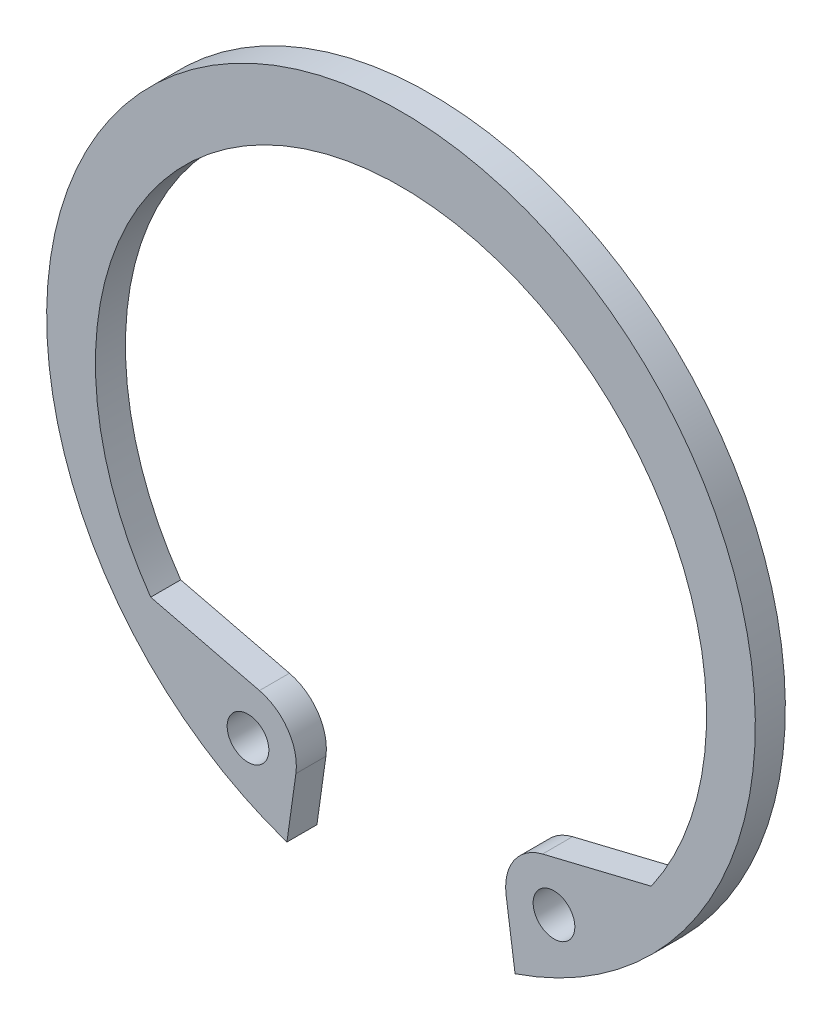
ISO-10303-21;
HEADER;
FILE_DESCRIPTION(('STEP AP214'),'2;1');
FILE_NAME('part.step','',(''),(''),'','','');
FILE_SCHEMA(('AUTOMOTIVE_DESIGN { 1 0 10303 214 1 1 1 1 }'));
ENDSEC;
DATA;
#1=APPLICATION_CONTEXT('core data for automotive mechanical design processes');
#2=APPLICATION_PROTOCOL_DEFINITION('international standard','automotive_design',2000,#1);
#3=PRODUCT_CONTEXT('',#1,'mechanical');
#4=PRODUCT('Part','Part','',(#3));
#5=PRODUCT_RELATED_PRODUCT_CATEGORY('part','',(#4));
#6=PRODUCT_DEFINITION_FORMATION('','',#4);
#7=PRODUCT_DEFINITION_CONTEXT('part definition',#1,'design');
#8=PRODUCT_DEFINITION('design','',#6,#7);
#9=PRODUCT_DEFINITION_SHAPE('','',#8);
#10=(LENGTH_UNIT() NAMED_UNIT(*) SI_UNIT(.MILLI.,.METRE.));
#11=(NAMED_UNIT(*) PLANE_ANGLE_UNIT() SI_UNIT($,.RADIAN.));
#12=(NAMED_UNIT(*) SI_UNIT($,.STERADIAN.) SOLID_ANGLE_UNIT());
#13=UNCERTAINTY_MEASURE_WITH_UNIT(LENGTH_MEASURE(1.E-05),#10,'distance_accuracy_value','');
#14=(GEOMETRIC_REPRESENTATION_CONTEXT(3) GLOBAL_UNCERTAINTY_ASSIGNED_CONTEXT((#13)) GLOBAL_UNIT_ASSIGNED_CONTEXT((#10,
#11,#12)) REPRESENTATION_CONTEXT('',''));
#15=CARTESIAN_POINT('',(0.,0.,0.));
#16=DIRECTION('',(0.,0.,1.));
#17=DIRECTION('',(1.,0.,0.));
#18=AXIS2_PLACEMENT_3D('',#15,#16,#17);
#19=CARTESIAN_POINT('',(-8.48890326991949,-13.0738949087531,1.8));
#20=DIRECTION('',(-0.236585079338112,-0.971610776100481,0.));
#21=DIRECTION('',(0.971610776100481,-0.236585079338112,0.));
#22=AXIS2_PLACEMENT_3D('',#19,#20,#21);
#23=PLANE('',#22);
#24=DIRECTION('',(-0.971610776100481,0.236585079338112,0.));
#25=VECTOR('',#24,1.);
#26=CARTESIAN_POINT('',(-8.48890326991949,-13.0738949087531,0.));
#27=LINE('',#26,#25);
#28=CARTESIAN_POINT('',(-8.48890326991949,-13.0738949087531,0.));
#29=VERTEX_POINT('',#28);
#30=CARTESIAN_POINT('',(-15.0109612115958,-11.4857881961329,0.));
#31=VERTEX_POINT('',#30);
#32=EDGE_CURVE('E98',#29,#31,#27,.T.);
#33=ORIENTED_EDGE('',*,*,#32,.T.);
#34=DIRECTION('',(0.,0.,-1.));
#35=VECTOR('',#34,1.);
#36=CARTESIAN_POINT('',(-15.0109612115958,-11.4857881961329,1.8));
#37=LINE('',#36,#35);
#38=CARTESIAN_POINT('',(-15.0109612115958,-11.4857881961329,1.8));
#39=VERTEX_POINT('',#38);
#40=EDGE_CURVE('E11',#39,#31,#37,.T.);
#41=ORIENTED_EDGE('',*,*,#40,.F.);
#42=DIRECTION('',(-0.971610776100481,0.236585079338112,0.));
#43=VECTOR('',#42,1.);
#44=CARTESIAN_POINT('',(-8.48890326991949,-13.0738949087531,1.8));
#45=LINE('',#44,#43);
#46=CARTESIAN_POINT('',(-8.48890326991949,-13.0738949087531,1.8));
#47=VERTEX_POINT('',#46);
#48=EDGE_CURVE('E118',#47,#39,#45,.T.);
#49=ORIENTED_EDGE('',*,*,#48,.F.);
#50=DIRECTION('',(0.,0.,-1.));
#51=VECTOR('',#50,1.);
#52=CARTESIAN_POINT('',(-8.48890326991949,-13.0738949087531,1.8));
#53=LINE('',#52,#51);
#54=EDGE_CURVE('E133',#47,#29,#53,.T.);
#55=ORIENTED_EDGE('',*,*,#54,.T.);
#56=EDGE_LOOP('',(#33,#41,#49,#55));
#57=FACE_BOUND('',#56,.T.);
#58=ADVANCED_FACE('F17',(#57),#23,.F.);
#59=CARTESIAN_POINT('',(0.,-0.975,1.8));
#60=DIRECTION('',(0.,0.,-1.));
#61=DIRECTION('',(-1.,0.,0.));
#62=AXIS2_PLACEMENT_3D('',#59,#60,#61);
#63=CYLINDRICAL_SURFACE('',#62,18.325);
#64=CARTESIAN_POINT('',(0.,-0.975,0.));
#65=DIRECTION('',(0.,0.,1.));
#66=DIRECTION('',(1.,0.,0.));
#67=AXIS2_PLACEMENT_3D('',#64,#65,#66);
#68=CIRCLE('',#67,18.325);
#69=CARTESIAN_POINT('',(15.0109612115957,-11.4857881961329,0.));
#70=VERTEX_POINT('',#69);
#71=EDGE_CURVE('E92',#70,#31,#68,.T.);
#72=ORIENTED_EDGE('',*,*,#71,.F.);
#73=DIRECTION('',(0.,0.,-1.));
#74=VECTOR('',#73,1.);
#75=CARTESIAN_POINT('',(15.0109612115957,-11.4857881961329,1.8));
#76=LINE('',#75,#74);
#77=CARTESIAN_POINT('',(15.0109612115957,-11.4857881961329,1.8));
#78=VERTEX_POINT('',#77);
#79=EDGE_CURVE('E20',#78,#70,#76,.T.);
#80=ORIENTED_EDGE('',*,*,#79,.F.);
#81=CARTESIAN_POINT('',(0.,-0.975,1.8));
#82=DIRECTION('',(0.,0.,1.));
#83=DIRECTION('',(1.,0.,0.));
#84=AXIS2_PLACEMENT_3D('',#81,#82,#83);
#85=CIRCLE('',#84,18.325);
#86=EDGE_CURVE('E121',#78,#39,#85,.T.);
#87=ORIENTED_EDGE('',*,*,#86,.T.);
#88=ORIENTED_EDGE('',*,*,#40,.T.);
#89=EDGE_LOOP('',(#72,#80,#87,#88));
#90=FACE_BOUND('',#89,.T.);
#91=ADVANCED_FACE('F93',(#90),#63,.F.);
#92=CARTESIAN_POINT('',(8.48890326991948,-13.073894908753,1.8));
#93=DIRECTION('',(-0.236585079338107,0.971610776100482,0.));
#94=DIRECTION('',(-0.971610776100482,-0.236585079338107,0.));
#95=AXIS2_PLACEMENT_3D('',#92,#93,#94);
#96=PLANE('',#95);
#97=DIRECTION('',(0.971610776100482,0.236585079338107,0.));
#98=VECTOR('',#97,1.);
#99=CARTESIAN_POINT('',(8.48890326991948,-13.073894908753,0.));
#100=LINE('',#99,#98);
#101=CARTESIAN_POINT('',(8.48890326991948,-13.073894908753,0.));
#102=VERTEX_POINT('',#101);
#103=EDGE_CURVE('E84',#102,#70,#100,.T.);
#104=ORIENTED_EDGE('',*,*,#103,.F.);
#105=DIRECTION('',(0.,0.,-1.));
#106=VECTOR('',#105,1.);
#107=CARTESIAN_POINT('',(8.48890326991948,-13.073894908753,1.8));
#108=LINE('',#107,#106);
#109=CARTESIAN_POINT('',(8.48890326991948,-13.073894908753,1.8));
#110=VERTEX_POINT('',#109);
#111=EDGE_CURVE('E90',#110,#102,#108,.T.);
#112=ORIENTED_EDGE('',*,*,#111,.F.);
#113=DIRECTION('',(0.971610776100482,0.236585079338107,0.));
#114=VECTOR('',#113,1.);
#115=CARTESIAN_POINT('',(8.48890326991948,-13.073894908753,1.8));
#116=LINE('',#115,#114);
#117=EDGE_CURVE('E86',#110,#78,#116,.T.);
#118=ORIENTED_EDGE('',*,*,#117,.T.);
#119=ORIENTED_EDGE('',*,*,#79,.T.);
#120=EDGE_LOOP('',(#104,#112,#118,#119));
#121=FACE_BOUND('',#120,.T.);
#122=ADVANCED_FACE('F82',(#121),#96,.T.);
#123=CARTESIAN_POINT('',(9.175,-15.8915661594444,1.8));
#124=DIRECTION('',(0.,0.,-1.));
#125=DIRECTION('',(-1.,0.,0.));
#126=AXIS2_PLACEMENT_3D('',#123,#124,#125);
#127=CYLINDRICAL_SURFACE('',#126,2.9);
#128=CARTESIAN_POINT('',(9.175,-15.8915661594444,0.));
#129=DIRECTION('',(0.,0.,1.));
#130=DIRECTION('',(1.,0.,0.));
#131=AXIS2_PLACEMENT_3D('',#128,#129,#130);
#132=CIRCLE('',#131,2.9);
#133=CARTESIAN_POINT('',(6.30322260064945,-16.2951681522287,0.));
#134=VERTEX_POINT('',#133);
#135=EDGE_CURVE('E103',#102,#134,#132,.T.);
#136=ORIENTED_EDGE('',*,*,#135,.T.);
#137=DIRECTION('',(0.,0.,-1.));
#138=VECTOR('',#137,1.);
#139=CARTESIAN_POINT('',(6.30322260064945,-16.2951681522287,1.8));
#140=LINE('',#139,#138);
#141=CARTESIAN_POINT('',(6.30322260064945,-16.2951681522287,1.8));
#142=VERTEX_POINT('',#141);
#143=EDGE_CURVE('E143',#142,#134,#140,.T.);
#144=ORIENTED_EDGE('',*,*,#143,.F.);
#145=CARTESIAN_POINT('',(9.175,-15.8915661594444,1.8));
#146=DIRECTION('',(0.,0.,1.));
#147=DIRECTION('',(1.,0.,0.));
#148=AXIS2_PLACEMENT_3D('',#145,#146,#147);
#149=CIRCLE('',#148,2.9);
#150=EDGE_CURVE('E124',#110,#142,#149,.T.);
#151=ORIENTED_EDGE('',*,*,#150,.F.);
#152=ORIENTED_EDGE('',*,*,#111,.T.);
#153=EDGE_LOOP('',(#136,#144,#151,#152));
#154=FACE_BOUND('',#153,.T.);
#155=ADVANCED_FACE('F148',(#154),#127,.T.);
#156=CARTESIAN_POINT('',(6.30322260064945,-16.2951681522287,1.8));
#157=DIRECTION('',(0.990268068741571,0.139173100960064,0.));
#158=DIRECTION('',(-0.139173100960064,0.990268068741571,0.));
#159=AXIS2_PLACEMENT_3D('',#156,#157,#158);
#160=PLANE('',#159);
#161=DIRECTION('',(0.139173100960064,-0.99026806874157,0.));
#162=VECTOR('',#161,1.);
#163=CARTESIAN_POINT('',(6.30322260064945,-16.2951681522287,0.));
#164=LINE('',#163,#162);
#165=CARTESIAN_POINT('',(6.84060765155379,-20.1188614726953,0.));
#166=VERTEX_POINT('',#165);
#167=EDGE_CURVE('E105',#134,#166,#164,.T.);
#168=ORIENTED_EDGE('',*,*,#167,.T.);
#169=DIRECTION('',(0.,0.,-1.));
#170=VECTOR('',#169,1.);
#171=CARTESIAN_POINT('',(6.84060765155379,-20.1188614726953,1.8));
#172=LINE('',#171,#170);
#173=CARTESIAN_POINT('',(6.84060765155379,-20.1188614726953,1.8));
#174=VERTEX_POINT('',#173);
#175=EDGE_CURVE('E140',#174,#166,#172,.T.);
#176=ORIENTED_EDGE('',*,*,#175,.F.);
#177=DIRECTION('',(0.139173100960064,-0.99026806874157,0.));
#178=VECTOR('',#177,1.);
#179=CARTESIAN_POINT('',(6.30322260064945,-16.2951681522287,1.8));
#180=LINE('',#179,#178);
#181=EDGE_CURVE('E126',#142,#174,#180,.T.);
#182=ORIENTED_EDGE('',*,*,#181,.F.);
#183=ORIENTED_EDGE('',*,*,#143,.T.);
#184=EDGE_LOOP('',(#168,#176,#182,#183));
#185=FACE_BOUND('',#184,.T.);
#186=ADVANCED_FACE('F164',(#185),#160,.F.);
#187=CARTESIAN_POINT('',(0.,0.,1.8));
#188=DIRECTION('',(0.,0.,-1.));
#189=DIRECTION('',(-1.,0.,0.));
#190=AXIS2_PLACEMENT_3D('',#187,#188,#189);
#191=CYLINDRICAL_SURFACE('',#190,21.25);
#192=CARTESIAN_POINT('',(0.,0.,0.));
#193=DIRECTION('',(0.,0.,1.));
#194=DIRECTION('',(1.,0.,0.));
#195=AXIS2_PLACEMENT_3D('',#192,#193,#194);
#196=CIRCLE('',#195,21.25);
#197=CARTESIAN_POINT('',(-6.8406076515538,-20.1188614726953,0.));
#198=VERTEX_POINT('',#197);
#199=EDGE_CURVE('E110',#166,#198,#196,.T.);
#200=ORIENTED_EDGE('',*,*,#199,.T.);
#201=DIRECTION('',(0.,0.,-1.));
#202=VECTOR('',#201,1.);
#203=CARTESIAN_POINT('',(-6.8406076515538,-20.1188614726953,1.8));
#204=LINE('',#203,#202);
#205=CARTESIAN_POINT('',(-6.8406076515538,-20.1188614726953,1.8));
#206=VERTEX_POINT('',#205);
#207=EDGE_CURVE('E138',#206,#198,#204,.T.);
#208=ORIENTED_EDGE('',*,*,#207,.F.);
#209=CARTESIAN_POINT('',(0.,0.,1.8));
#210=DIRECTION('',(0.,0.,1.));
#211=DIRECTION('',(1.,0.,0.));
#212=AXIS2_PLACEMENT_3D('',#209,#210,#211);
#213=CIRCLE('',#212,21.25);
#214=EDGE_CURVE('E128',#174,#206,#213,.T.);
#215=ORIENTED_EDGE('',*,*,#214,.F.);
#216=ORIENTED_EDGE('',*,*,#175,.T.);
#217=EDGE_LOOP('',(#200,#208,#215,#216));
#218=FACE_BOUND('',#217,.T.);
#219=ADVANCED_FACE('F161',(#218),#191,.T.);
#220=CARTESIAN_POINT('',(-6.30322260064944,-16.2951681522287,1.8));
#221=DIRECTION('',(0.99026806874157,-0.139173100960068,0.));
#222=DIRECTION('',(0.139173100960068,0.99026806874157,0.));
#223=AXIS2_PLACEMENT_3D('',#220,#221,#222);
#224=PLANE('',#223);
#225=DIRECTION('',(-0.139173100960068,-0.99026806874157,0.));
#226=VECTOR('',#225,1.);
#227=CARTESIAN_POINT('',(-6.30322260064944,-16.2951681522287,0.));
#228=LINE('',#227,#226);
#229=CARTESIAN_POINT('',(-6.30322260064944,-16.2951681522287,0.));
#230=VERTEX_POINT('',#229);
#231=EDGE_CURVE('E113',#230,#198,#228,.T.);
#232=ORIENTED_EDGE('',*,*,#231,.F.);
#233=DIRECTION('',(0.,0.,-1.));
#234=VECTOR('',#233,1.);
#235=CARTESIAN_POINT('',(-6.30322260064944,-16.2951681522287,1.8));
#236=LINE('',#235,#234);
#237=CARTESIAN_POINT('',(-6.30322260064944,-16.2951681522287,1.8));
#238=VERTEX_POINT('',#237);
#239=EDGE_CURVE('E39',#238,#230,#236,.T.);
#240=ORIENTED_EDGE('',*,*,#239,.F.);
#241=DIRECTION('',(-0.139173100960068,-0.99026806874157,0.));
#242=VECTOR('',#241,1.);
#243=CARTESIAN_POINT('',(-6.30322260064944,-16.2951681522287,1.8));
#244=LINE('',#243,#242);
#245=EDGE_CURVE('E130',#238,#206,#244,.T.);
#246=ORIENTED_EDGE('',*,*,#245,.T.);
#247=ORIENTED_EDGE('',*,*,#207,.T.);
#248=EDGE_LOOP('',(#232,#240,#246,#247));
#249=FACE_BOUND('',#248,.T.);
#250=ADVANCED_FACE('F157',(#249),#224,.T.);
#251=CARTESIAN_POINT('',(-9.175,-15.8915661594444,1.8));
#252=DIRECTION('',(0.,0.,-1.));
#253=DIRECTION('',(-1.,0.,0.));
#254=AXIS2_PLACEMENT_3D('',#251,#252,#253);
#255=CYLINDRICAL_SURFACE('',#254,2.9);
#256=CARTESIAN_POINT('',(-9.175,-15.8915661594444,0.));
#257=DIRECTION('',(0.,0.,1.));
#258=DIRECTION('',(1.,0.,0.));
#259=AXIS2_PLACEMENT_3D('',#256,#257,#258);
#260=CIRCLE('',#259,2.9);
#261=EDGE_CURVE('E116',#230,#29,#260,.T.);
#262=ORIENTED_EDGE('',*,*,#261,.T.);
#263=ORIENTED_EDGE('',*,*,#54,.F.);
#264=CARTESIAN_POINT('',(-9.175,-15.8915661594444,1.8));
#265=DIRECTION('',(0.,0.,1.));
#266=DIRECTION('',(1.,0.,0.));
#267=AXIS2_PLACEMENT_3D('',#264,#265,#266);
#268=CIRCLE('',#267,2.9);
#269=EDGE_CURVE('E31',#238,#47,#268,.T.);
#270=ORIENTED_EDGE('',*,*,#269,.F.);
#271=ORIENTED_EDGE('',*,*,#239,.T.);
#272=EDGE_LOOP('',(#262,#263,#270,#271));
#273=FACE_BOUND('',#272,.T.);
#274=ADVANCED_FACE('F212',(#273),#255,.T.);
#275=CARTESIAN_POINT('',(0.,-0.975,1.8));
#276=DIRECTION('',(0.,0.,1.));
#277=DIRECTION('',(1.,0.,0.));
#278=AXIS2_PLACEMENT_3D('',#275,#276,#277);
#279=PLANE('',#278);
#280=CARTESIAN_POINT('',(9.175,-15.8915661594444,1.8));
#281=DIRECTION('',(0.,0.,-1.));
#282=DIRECTION('',(0.,1.,0.));
#283=AXIS2_PLACEMENT_3D('',#280,#281,#282);
#284=CIRCLE('',#283,1.25);
#285=CARTESIAN_POINT('',(9.175,-14.6415661594445,1.8));
#286=VERTEX_POINT('',#285);
#287=EDGE_CURVE('E267',#286,#286,#284,.T.);
#288=ORIENTED_EDGE('',*,*,#287,.T.);
#289=EDGE_LOOP('',(#288));
#290=FACE_BOUND('',#289,.T.);
#291=CARTESIAN_POINT('',(-9.175,-15.8915661594444,1.8));
#292=DIRECTION('',(0.,0.,-1.));
#293=DIRECTION('',(0.,1.,0.));
#294=AXIS2_PLACEMENT_3D('',#291,#292,#293);
#295=CIRCLE('',#294,1.25);
#296=CARTESIAN_POINT('',(-9.175,-14.6415661594445,1.8));
#297=VERTEX_POINT('',#296);
#298=EDGE_CURVE('E120',#297,#297,#295,.T.);
#299=ORIENTED_EDGE('',*,*,#298,.T.);
#300=EDGE_LOOP('',(#299));
#301=FACE_BOUND('',#300,.T.);
#302=ORIENTED_EDGE('',*,*,#48,.T.);
#303=ORIENTED_EDGE('',*,*,#86,.F.);
#304=ORIENTED_EDGE('',*,*,#117,.F.);
#305=ORIENTED_EDGE('',*,*,#150,.T.);
#306=ORIENTED_EDGE('',*,*,#181,.T.);
#307=ORIENTED_EDGE('',*,*,#214,.T.);
#308=ORIENTED_EDGE('',*,*,#245,.F.);
#309=ORIENTED_EDGE('',*,*,#269,.T.);
#310=EDGE_LOOP('',(#302,#303,#304,#305,#306,#307,#308,#309));
#311=FACE_BOUND('',#310,.T.);
#312=ADVANCED_FACE('F151',(#290,#301,#311),#279,.T.);
#313=CARTESIAN_POINT('',(0.,-0.975,0.));
#314=DIRECTION('',(0.,0.,1.));
#315=DIRECTION('',(1.,0.,0.));
#316=AXIS2_PLACEMENT_3D('',#313,#314,#315);
#317=PLANE('',#316);
#318=CARTESIAN_POINT('',(9.175,-15.8915661594444,0.));
#319=DIRECTION('',(0.,0.,1.));
#320=DIRECTION('',(0.,1.,0.));
#321=AXIS2_PLACEMENT_3D('',#318,#319,#320);
#322=CIRCLE('',#321,1.25);
#323=CARTESIAN_POINT('',(9.175,-14.6415661594445,0.));
#324=VERTEX_POINT('',#323);
#325=EDGE_CURVE('E270',#324,#324,#322,.T.);
#326=ORIENTED_EDGE('',*,*,#325,.T.);
#327=EDGE_LOOP('',(#326));
#328=FACE_BOUND('',#327,.T.);
#329=CARTESIAN_POINT('',(-9.175,-15.8915661594444,0.));
#330=DIRECTION('',(0.,0.,1.));
#331=DIRECTION('',(0.,1.,0.));
#332=AXIS2_PLACEMENT_3D('',#329,#330,#331);
#333=CIRCLE('',#332,1.25);
#334=CARTESIAN_POINT('',(-9.175,-14.6415661594445,0.));
#335=VERTEX_POINT('',#334);
#336=EDGE_CURVE('E272',#335,#335,#333,.T.);
#337=ORIENTED_EDGE('',*,*,#336,.T.);
#338=EDGE_LOOP('',(#337));
#339=FACE_BOUND('',#338,.T.);
#340=ORIENTED_EDGE('',*,*,#32,.F.);
#341=ORIENTED_EDGE('',*,*,#261,.F.);
#342=ORIENTED_EDGE('',*,*,#231,.T.);
#343=ORIENTED_EDGE('',*,*,#199,.F.);
#344=ORIENTED_EDGE('',*,*,#167,.F.);
#345=ORIENTED_EDGE('',*,*,#135,.F.);
#346=ORIENTED_EDGE('',*,*,#103,.T.);
#347=ORIENTED_EDGE('',*,*,#71,.T.);
#348=EDGE_LOOP('',(#340,#341,#342,#343,#344,#345,#346,#347));
#349=FACE_BOUND('',#348,.T.);
#350=ADVANCED_FACE('F101',(#328,#339,#349),#317,.F.);
#351=CARTESIAN_POINT('',(-9.175,-15.8915661594444,0.));
#352=DIRECTION('',(0.,0.,1.));
#353=DIRECTION('',(0.,1.,0.));
#354=AXIS2_PLACEMENT_3D('',#351,#352,#353);
#355=CYLINDRICAL_SURFACE('',#354,1.25);
#356=ORIENTED_EDGE('',*,*,#298,.F.);
#357=EDGE_LOOP('',(#356));
#358=FACE_BOUND('',#357,.T.);
#359=ORIENTED_EDGE('',*,*,#336,.F.);
#360=EDGE_LOOP('',(#359));
#361=FACE_BOUND('',#360,.T.);
#362=ADVANCED_FACE('F238',(#358,#361),#355,.F.);
#363=CARTESIAN_POINT('',(9.175,-15.8915661594444,0.));
#364=DIRECTION('',(0.,0.,1.));
#365=DIRECTION('',(0.,1.,0.));
#366=AXIS2_PLACEMENT_3D('',#363,#364,#365);
#367=CYLINDRICAL_SURFACE('',#366,1.25);
#368=ORIENTED_EDGE('',*,*,#287,.F.);
#369=EDGE_LOOP('',(#368));
#370=FACE_BOUND('',#369,.T.);
#371=ORIENTED_EDGE('',*,*,#325,.F.);
#372=EDGE_LOOP('',(#371));
#373=FACE_BOUND('',#372,.T.);
#374=ADVANCED_FACE('F248',(#370,#373),#367,.F.);
#375=CLOSED_SHELL('',(#58,#91,#122,#155,#186,#219,#250,#274,#312,#350,#362,#374));
#376=MANIFOLD_SOLID_BREP('B1',#375);
#377=ADVANCED_BREP_SHAPE_REPRESENTATION('',(#18,#376),#14);
#378=SHAPE_DEFINITION_REPRESENTATION(#9,#377);
ENDSEC;
END-ISO-10303-21;
